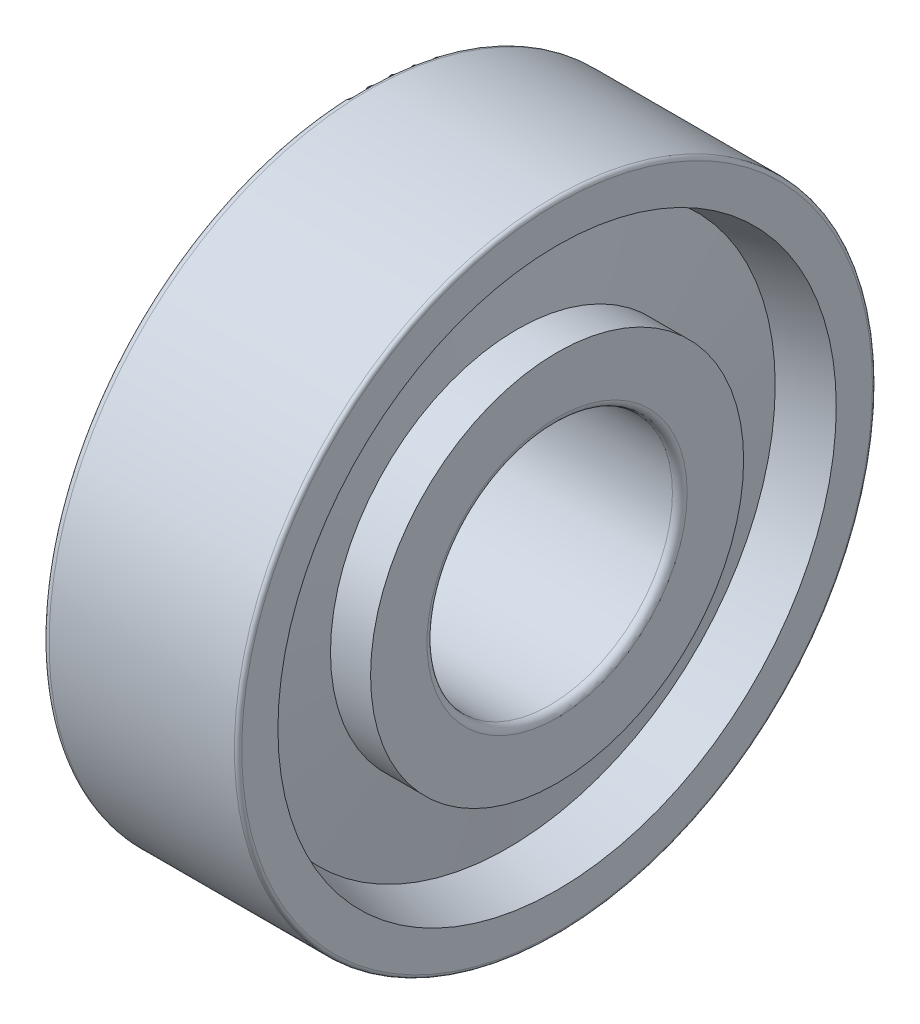
ISO-10303-21;
HEADER;
FILE_DESCRIPTION(('STEP AP214'),'2;1');
FILE_NAME('part.step','',(''),(''),'','','');
FILE_SCHEMA(('AUTOMOTIVE_DESIGN { 1 0 10303 214 1 1 1 1 }'));
ENDSEC;
DATA;
#1=APPLICATION_CONTEXT('core data for automotive mechanical design processes');
#2=APPLICATION_PROTOCOL_DEFINITION('international standard','automotive_design',2000,#1);
#3=PRODUCT_CONTEXT('',#1,'mechanical');
#4=PRODUCT('Part','Part','',(#3));
#5=PRODUCT_RELATED_PRODUCT_CATEGORY('part','',(#4));
#6=PRODUCT_DEFINITION_FORMATION('','',#4);
#7=PRODUCT_DEFINITION_CONTEXT('part definition',#1,'design');
#8=PRODUCT_DEFINITION('design','',#6,#7);
#9=PRODUCT_DEFINITION_SHAPE('','',#8);
#10=(LENGTH_UNIT() NAMED_UNIT(*) SI_UNIT(.MILLI.,.METRE.));
#11=(NAMED_UNIT(*) PLANE_ANGLE_UNIT() SI_UNIT($,.RADIAN.));
#12=(NAMED_UNIT(*) SI_UNIT($,.STERADIAN.) SOLID_ANGLE_UNIT());
#13=UNCERTAINTY_MEASURE_WITH_UNIT(LENGTH_MEASURE(1.E-05),#10,'distance_accuracy_value','');
#14=(GEOMETRIC_REPRESENTATION_CONTEXT(3) GLOBAL_UNCERTAINTY_ASSIGNED_CONTEXT((#13)) GLOBAL_UNIT_ASSIGNED_CONTEXT((#10,
#11,#12)) REPRESENTATION_CONTEXT('',''));
#15=CARTESIAN_POINT('',(0.,0.,0.));
#16=DIRECTION('',(0.,0.,1.));
#17=DIRECTION('',(1.,0.,0.));
#18=AXIS2_PLACEMENT_3D('',#15,#16,#17);
#19=CARTESIAN_POINT('',(0.,6.625,0.));
#20=DIRECTION('',(-1.,0.,0.));
#21=DIRECTION('',(0.,0.,1.));
#22=AXIS2_PLACEMENT_3D('',#19,#20,#21);
#23=PLANE('',#22);
#24=CARTESIAN_POINT('',(0.,0.,0.));
#25=DIRECTION('',(1.,0.,0.));
#26=DIRECTION('',(0.,0.,-1.));
#27=AXIS2_PLACEMENT_3D('',#24,#25,#26);
#28=CIRCLE('',#27,5.15);
#29=CARTESIAN_POINT('',(0.,0.,-5.15));
#30=VERTEX_POINT('',#29);
#31=EDGE_CURVE('E125',#30,#30,#28,.T.);
#32=ORIENTED_EDGE('',*,*,#31,.T.);
#33=EDGE_LOOP('',(#32));
#34=FACE_BOUND('',#33,.T.);
#35=CARTESIAN_POINT('',(0.,0.,0.));
#36=DIRECTION('',(1.,0.,0.));
#37=DIRECTION('',(0.,0.,-1.));
#38=AXIS2_PLACEMENT_3D('',#35,#36,#37);
#39=CIRCLE('',#38,6.625);
#40=CARTESIAN_POINT('',(0.,0.,-6.625));
#41=VERTEX_POINT('',#40);
#42=EDGE_CURVE('E120',#41,#41,#39,.T.);
#43=ORIENTED_EDGE('',*,*,#42,.F.);
#44=EDGE_LOOP('',(#43));
#45=FACE_BOUND('',#44,.T.);
#46=ADVANCED_FACE('F46',(#34,#45),#23,.T.);
#47=CARTESIAN_POINT('',(0.149999999999969,0.,0.));
#48=DIRECTION('',(1.,0.,0.));
#49=DIRECTION('',(0.,0.,-1.));
#50=AXIS2_PLACEMENT_3D('',#47,#48,#49);
#51=TOROIDAL_SURFACE('',#50,5.15,0.149999999999969);
#52=CARTESIAN_POINT('',(0.15,0.,0.));
#53=DIRECTION('',(1.,0.,0.));
#54=DIRECTION('',(0.,0.,-1.));
#55=AXIS2_PLACEMENT_3D('',#52,#53,#54);
#56=CIRCLE('',#55,5.);
#57=CARTESIAN_POINT('',(0.15,0.,-5.));
#58=VERTEX_POINT('',#57);
#59=EDGE_CURVE('E116',#58,#58,#56,.T.);
#60=ORIENTED_EDGE('',*,*,#59,.T.);
#61=EDGE_LOOP('',(#60));
#62=FACE_BOUND('',#61,.T.);
#63=ORIENTED_EDGE('',*,*,#31,.F.);
#64=EDGE_LOOP('',(#63));
#65=FACE_BOUND('',#64,.T.);
#66=ADVANCED_FACE('F136',(#62,#65),#51,.T.);
#67=CARTESIAN_POINT('',(2.0000317573387,0.,0.));
#68=DIRECTION('',(1.,0.,0.));
#69=DIRECTION('',(0.,0.,-1.));
#70=AXIS2_PLACEMENT_3D('',#67,#68,#69);
#71=CONICAL_SURFACE('',#70,7.1125077408513,0.239087715072563);
#72=ORIENTED_EDGE('',*,*,#42,.T.);
#73=EDGE_LOOP('',(#72));
#74=FACE_BOUND('',#73,.T.);
#75=CARTESIAN_POINT('',(2.0000317573387,0.,0.));
#76=DIRECTION('',(1.,0.,0.));
#77=DIRECTION('',(0.,0.,-1.));
#78=AXIS2_PLACEMENT_3D('',#75,#76,#77);
#79=CIRCLE('',#78,7.1125077408513);
#80=CARTESIAN_POINT('',(2.0000317573387,0.,-7.1125077408513));
#81=VERTEX_POINT('',#80);
#82=EDGE_CURVE('E112',#81,#81,#79,.T.);
#83=ORIENTED_EDGE('',*,*,#82,.F.);
#84=EDGE_LOOP('',(#83));
#85=FACE_BOUND('',#84,.T.);
#86=ADVANCED_FACE('F138',(#74,#85),#71,.T.);
#87=CARTESIAN_POINT('',(8.,0.,0.));
#88=DIRECTION('',(1.,0.,0.));
#89=DIRECTION('',(0.,0.,-1.));
#90=AXIS2_PLACEMENT_3D('',#87,#88,#89);
#91=CYLINDRICAL_SURFACE('',#90,5.);
#92=CARTESIAN_POINT('',(7.7,0.,0.));
#93=DIRECTION('',(1.,0.,0.));
#94=DIRECTION('',(0.,0.,-1.));
#95=AXIS2_PLACEMENT_3D('',#92,#93,#94);
#96=CIRCLE('',#95,5.);
#97=CARTESIAN_POINT('',(7.7,0.,-5.));
#98=VERTEX_POINT('',#97);
#99=EDGE_CURVE('E108',#98,#98,#96,.T.);
#100=ORIENTED_EDGE('',*,*,#99,.T.);
#101=EDGE_LOOP('',(#100));
#102=FACE_BOUND('',#101,.T.);
#103=ORIENTED_EDGE('',*,*,#59,.F.);
#104=EDGE_LOOP('',(#103));
#105=FACE_BOUND('',#104,.T.);
#106=ADVANCED_FACE('F144',(#102,#105),#91,.F.);
#107=CARTESIAN_POINT('',(1.6330399242911,0.,0.));
#108=DIRECTION('',(-1.,0.,0.));
#109=DIRECTION('',(0.,0.,1.));
#110=AXIS2_PLACEMENT_3D('',#107,#108,#109);
#111=CONICAL_SURFACE('',#110,10.4,1.45962384824669);
#112=ORIENTED_EDGE('',*,*,#82,.T.);
#113=EDGE_LOOP('',(#112));
#114=FACE_BOUND('',#113,.T.);
#115=CARTESIAN_POINT('',(1.6330399242911,0.,0.));
#116=DIRECTION('',(1.,0.,0.));
#117=DIRECTION('',(0.,0.,-1.));
#118=AXIS2_PLACEMENT_3D('',#115,#116,#117);
#119=CIRCLE('',#118,10.4);
#120=CARTESIAN_POINT('',(1.6330399242911,0.,-10.4));
#121=VERTEX_POINT('',#120);
#122=EDGE_CURVE('E104',#121,#121,#119,.T.);
#123=ORIENTED_EDGE('',*,*,#122,.F.);
#124=EDGE_LOOP('',(#123));
#125=FACE_BOUND('',#124,.T.);
#126=ADVANCED_FACE('F152',(#114,#125),#111,.F.);
#127=CARTESIAN_POINT('',(7.70000000000012,0.,0.));
#128=DIRECTION('',(1.,0.,0.));
#129=DIRECTION('',(0.,0.,-1.));
#130=AXIS2_PLACEMENT_3D('',#127,#128,#129);
#131=TOROIDAL_SURFACE('',#130,5.29999999999988,0.299999999999876);
#132=CARTESIAN_POINT('',(8.,0.,0.));
#133=DIRECTION('',(1.,0.,0.));
#134=DIRECTION('',(0.,0.,-1.));
#135=AXIS2_PLACEMENT_3D('',#132,#133,#134);
#136=CIRCLE('',#135,5.29999999999988);
#137=CARTESIAN_POINT('',(8.,0.,-5.29999999999988));
#138=VERTEX_POINT('',#137);
#139=EDGE_CURVE('E99',#138,#138,#136,.T.);
#140=ORIENTED_EDGE('',*,*,#139,.T.);
#141=EDGE_LOOP('',(#140));
#142=FACE_BOUND('',#141,.T.);
#143=ORIENTED_EDGE('',*,*,#99,.F.);
#144=EDGE_LOOP('',(#143));
#145=FACE_BOUND('',#144,.T.);
#146=ADVANCED_FACE('F156',(#142,#145),#131,.T.);
#147=CARTESIAN_POINT('',(8.,0.,0.));
#148=DIRECTION('',(1.,0.,0.));
#149=DIRECTION('',(0.,0.,-1.));
#150=AXIS2_PLACEMENT_3D('',#147,#148,#149);
#151=CYLINDRICAL_SURFACE('',#150,10.4);
#152=ORIENTED_EDGE('',*,*,#122,.T.);
#153=EDGE_LOOP('',(#152));
#154=FACE_BOUND('',#153,.T.);
#155=CARTESIAN_POINT('',(0.,0.,0.));
#156=DIRECTION('',(1.,0.,0.));
#157=DIRECTION('',(0.,0.,-1.));
#158=AXIS2_PLACEMENT_3D('',#155,#156,#157);
#159=CIRCLE('',#158,10.4);
#160=CARTESIAN_POINT('',(0.,0.,-10.4));
#161=VERTEX_POINT('',#160);
#162=EDGE_CURVE('E95',#161,#161,#159,.T.);
#163=ORIENTED_EDGE('',*,*,#162,.F.);
#164=EDGE_LOOP('',(#163));
#165=FACE_BOUND('',#164,.T.);
#166=ADVANCED_FACE('F160',(#154,#165),#151,.F.);
#167=CARTESIAN_POINT('',(8.,5.3,0.));
#168=DIRECTION('',(1.,0.,0.));
#169=DIRECTION('',(0.,0.,-1.));
#170=AXIS2_PLACEMENT_3D('',#167,#168,#169);
#171=PLANE('',#170);
#172=CARTESIAN_POINT('',(8.,0.,0.));
#173=DIRECTION('',(1.,0.,0.));
#174=DIRECTION('',(0.,0.,-1.));
#175=AXIS2_PLACEMENT_3D('',#172,#173,#174);
#176=CIRCLE('',#175,7.6);
#177=CARTESIAN_POINT('',(8.,0.,-7.6));
#178=VERTEX_POINT('',#177);
#179=EDGE_CURVE('E87',#178,#178,#176,.T.);
#180=ORIENTED_EDGE('',*,*,#179,.T.);
#181=EDGE_LOOP('',(#180));
#182=FACE_BOUND('',#181,.T.);
#183=ORIENTED_EDGE('',*,*,#139,.F.);
#184=EDGE_LOOP('',(#183));
#185=FACE_BOUND('',#184,.T.);
#186=ADVANCED_FACE('F164',(#182,#185),#171,.T.);
#187=CARTESIAN_POINT('',(0.,12.7,0.));
#188=DIRECTION('',(-1.,0.,0.));
#189=DIRECTION('',(0.,0.,1.));
#190=AXIS2_PLACEMENT_3D('',#187,#188,#189);
#191=PLANE('',#190);
#192=ORIENTED_EDGE('',*,*,#162,.T.);
#193=EDGE_LOOP('',(#192));
#194=FACE_BOUND('',#193,.T.);
#195=CARTESIAN_POINT('',(0.,0.,0.));
#196=DIRECTION('',(1.,0.,0.));
#197=DIRECTION('',(0.,0.,-1.));
#198=AXIS2_PLACEMENT_3D('',#195,#196,#197);
#199=CIRCLE('',#198,12.7);
#200=CARTESIAN_POINT('',(0.,0.,-12.7));
#201=VERTEX_POINT('',#200);
#202=EDGE_CURVE('E82',#201,#201,#199,.T.);
#203=ORIENTED_EDGE('',*,*,#202,.F.);
#204=EDGE_LOOP('',(#203));
#205=FACE_BOUND('',#204,.T.);
#206=ADVANCED_FACE('F168',(#194,#205),#191,.T.);
#207=CARTESIAN_POINT('',(8.,0.,0.));
#208=DIRECTION('',(1.,0.,0.));
#209=DIRECTION('',(0.,0.,-1.));
#210=AXIS2_PLACEMENT_3D('',#207,#208,#209);
#211=CYLINDRICAL_SURFACE('',#210,7.6);
#212=CARTESIAN_POINT('',(6.3669600757089,0.,0.));
#213=DIRECTION('',(1.,0.,0.));
#214=DIRECTION('',(0.,0.,-1.));
#215=AXIS2_PLACEMENT_3D('',#212,#213,#214);
#216=CIRCLE('',#215,7.6);
#217=CARTESIAN_POINT('',(6.3669600757089,0.,-7.6));
#218=VERTEX_POINT('',#217);
#219=EDGE_CURVE('E78',#218,#218,#216,.T.);
#220=ORIENTED_EDGE('',*,*,#219,.T.);
#221=EDGE_LOOP('',(#220));
#222=FACE_BOUND('',#221,.T.);
#223=ORIENTED_EDGE('',*,*,#179,.F.);
#224=EDGE_LOOP('',(#223));
#225=FACE_BOUND('',#224,.T.);
#226=ADVANCED_FACE('F172',(#222,#225),#211,.T.);
#227=CARTESIAN_POINT('',(0.29999999999994,0.,0.));
#228=DIRECTION('',(1.,0.,0.));
#229=DIRECTION('',(0.,0.,-1.));
#230=AXIS2_PLACEMENT_3D('',#227,#228,#229);
#231=TOROIDAL_SURFACE('',#230,12.7,0.299999999999939);
#232=ORIENTED_EDGE('',*,*,#202,.T.);
#233=EDGE_LOOP('',(#232));
#234=FACE_BOUND('',#233,.T.);
#235=CARTESIAN_POINT('',(0.3,0.,0.));
#236=DIRECTION('',(1.,0.,0.));
#237=DIRECTION('',(0.,0.,-1.));
#238=AXIS2_PLACEMENT_3D('',#235,#236,#237);
#239=CIRCLE('',#238,13.);
#240=CARTESIAN_POINT('',(0.3,0.,-13.));
#241=VERTEX_POINT('',#240);
#242=EDGE_CURVE('E74',#241,#241,#239,.T.);
#243=ORIENTED_EDGE('',*,*,#242,.F.);
#244=EDGE_LOOP('',(#243));
#245=FACE_BOUND('',#244,.T.);
#246=ADVANCED_FACE('F176',(#234,#245),#231,.T.);
#247=CARTESIAN_POINT('',(6.3669600757089,0.,0.));
#248=DIRECTION('',(-1.,0.,0.));
#249=DIRECTION('',(0.,0.,1.));
#250=AXIS2_PLACEMENT_3D('',#247,#248,#249);
#251=CONICAL_SURFACE('',#250,7.6,1.4596238482467);
#252=CARTESIAN_POINT('',(5.9999682426613,0.,0.));
#253=DIRECTION('',(1.,0.,0.));
#254=DIRECTION('',(0.,0.,-1.));
#255=AXIS2_PLACEMENT_3D('',#252,#253,#254);
#256=CIRCLE('',#255,10.887492259149);
#257=CARTESIAN_POINT('',(5.9999682426613,0.,-10.887492259149));
#258=VERTEX_POINT('',#257);
#259=EDGE_CURVE('E67',#258,#258,#256,.T.);
#260=ORIENTED_EDGE('',*,*,#259,.T.);
#261=EDGE_LOOP('',(#260));
#262=FACE_BOUND('',#261,.T.);
#263=ORIENTED_EDGE('',*,*,#219,.F.);
#264=EDGE_LOOP('',(#263));
#265=FACE_BOUND('',#264,.T.);
#266=ADVANCED_FACE('F180',(#262,#265),#251,.T.);
#267=CARTESIAN_POINT('',(8.,0.,0.));
#268=DIRECTION('',(1.,0.,0.));
#269=DIRECTION('',(0.,0.,-1.));
#270=AXIS2_PLACEMENT_3D('',#267,#268,#269);
#271=CYLINDRICAL_SURFACE('',#270,13.);
#272=ORIENTED_EDGE('',*,*,#242,.T.);
#273=EDGE_LOOP('',(#272));
#274=FACE_BOUND('',#273,.T.);
#275=CARTESIAN_POINT('',(7.85,0.,0.));
#276=DIRECTION('',(1.,0.,0.));
#277=DIRECTION('',(0.,0.,-1.));
#278=AXIS2_PLACEMENT_3D('',#275,#276,#277);
#279=CIRCLE('',#278,13.);
#280=CARTESIAN_POINT('',(7.85,0.,-13.));
#281=VERTEX_POINT('',#280);
#282=EDGE_CURVE('E61',#281,#281,#279,.T.);
#283=ORIENTED_EDGE('',*,*,#282,.F.);
#284=EDGE_LOOP('',(#283));
#285=FACE_BOUND('',#284,.T.);
#286=ADVANCED_FACE('F184',(#274,#285),#271,.T.);
#287=CARTESIAN_POINT('',(5.9999682426613,0.,0.));
#288=DIRECTION('',(1.,0.,0.));
#289=DIRECTION('',(0.,0.,-1.));
#290=AXIS2_PLACEMENT_3D('',#287,#288,#289);
#291=CONICAL_SURFACE('',#290,10.887492259149,0.239087715072419);
#292=CARTESIAN_POINT('',(8.,0.,0.));
#293=DIRECTION('',(1.,0.,0.));
#294=DIRECTION('',(0.,0.,-1.));
#295=AXIS2_PLACEMENT_3D('',#292,#293,#294);
#296=CIRCLE('',#295,11.375);
#297=CARTESIAN_POINT('',(8.,0.,-11.375));
#298=VERTEX_POINT('',#297);
#299=EDGE_CURVE('E54',#298,#298,#296,.T.);
#300=ORIENTED_EDGE('',*,*,#299,.T.);
#301=EDGE_LOOP('',(#300));
#302=FACE_BOUND('',#301,.T.);
#303=ORIENTED_EDGE('',*,*,#259,.F.);
#304=EDGE_LOOP('',(#303));
#305=FACE_BOUND('',#304,.T.);
#306=ADVANCED_FACE('F188',(#302,#305),#291,.F.);
#307=CARTESIAN_POINT('',(7.85,0.,0.));
#308=DIRECTION('',(1.,0.,0.));
#309=DIRECTION('',(0.,0.,-1.));
#310=AXIS2_PLACEMENT_3D('',#307,#308,#309);
#311=TOROIDAL_SURFACE('',#310,12.85,0.149999999999944);
#312=ORIENTED_EDGE('',*,*,#282,.T.);
#313=EDGE_LOOP('',(#312));
#314=FACE_BOUND('',#313,.T.);
#315=CARTESIAN_POINT('',(8.,0.,0.));
#316=DIRECTION('',(1.,0.,0.));
#317=DIRECTION('',(0.,0.,-1.));
#318=AXIS2_PLACEMENT_3D('',#315,#316,#317);
#319=CIRCLE('',#318,12.85);
#320=CARTESIAN_POINT('',(8.,0.,-12.85));
#321=VERTEX_POINT('',#320);
#322=EDGE_CURVE('E11',#321,#321,#319,.T.);
#323=ORIENTED_EDGE('',*,*,#322,.F.);
#324=EDGE_LOOP('',(#323));
#325=FACE_BOUND('',#324,.T.);
#326=ADVANCED_FACE('F191',(#314,#325),#311,.T.);
#327=CARTESIAN_POINT('',(8.,11.375,0.));
#328=DIRECTION('',(1.,0.,0.));
#329=DIRECTION('',(0.,0.,-1.));
#330=AXIS2_PLACEMENT_3D('',#327,#328,#329);
#331=PLANE('',#330);
#332=ORIENTED_EDGE('',*,*,#322,.T.);
#333=EDGE_LOOP('',(#332));
#334=FACE_BOUND('',#333,.T.);
#335=ORIENTED_EDGE('',*,*,#299,.F.);
#336=EDGE_LOOP('',(#335));
#337=FACE_BOUND('',#336,.T.);
#338=ADVANCED_FACE('F48',(#334,#337),#331,.T.);
#339=CLOSED_SHELL('',(#46,#66,#86,#106,#126,#146,#166,#186,#206,#226,#246,#266,#286,#306,#326,#338));
#340=MANIFOLD_SOLID_BREP('B2',#339);
#341=ADVANCED_BREP_SHAPE_REPRESENTATION('',(#18,#340),#14);
#342=SHAPE_DEFINITION_REPRESENTATION(#9,#341);
ENDSEC;
END-ISO-10303-21;
